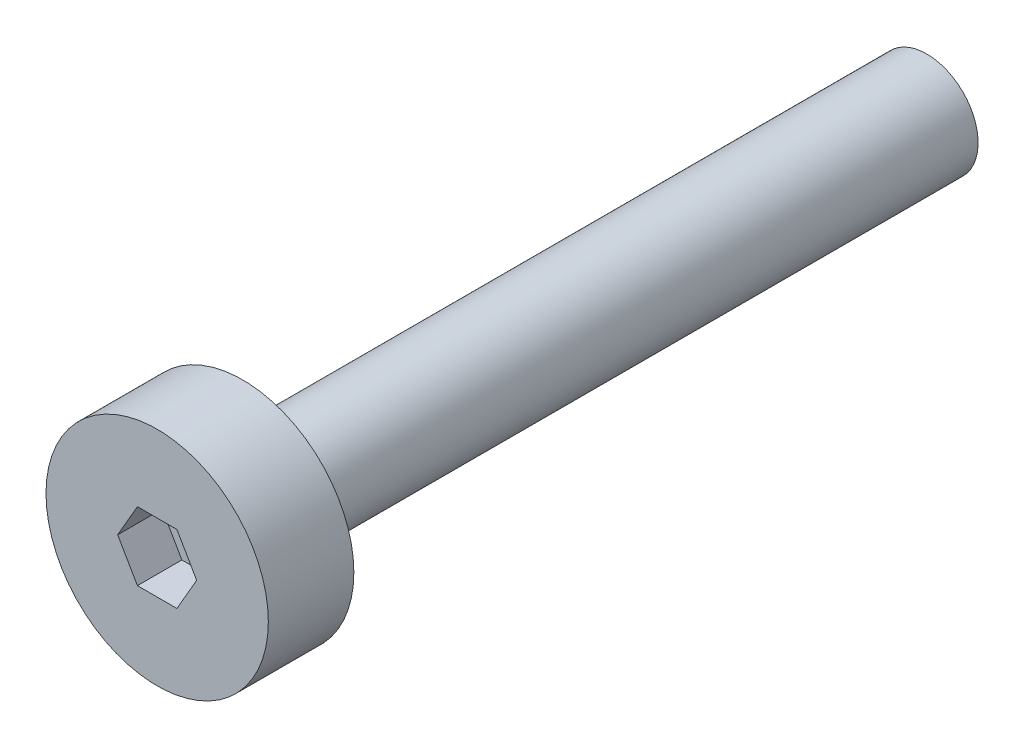
ISO-10303-21;
HEADER;
FILE_DESCRIPTION(('STEP AP214'),'2;1');
FILE_NAME('part.step','',(''),(''),'','','');
FILE_SCHEMA(('AUTOMOTIVE_DESIGN { 1 0 10303 214 1 1 1 1 }'));
ENDSEC;
DATA;
#1=APPLICATION_CONTEXT('core data for automotive mechanical design processes');
#2=APPLICATION_PROTOCOL_DEFINITION('international standard','automotive_design',2000,#1);
#3=PRODUCT_CONTEXT('',#1,'mechanical');
#4=PRODUCT('Part','Part','',(#3));
#5=PRODUCT_RELATED_PRODUCT_CATEGORY('part','',(#4));
#6=PRODUCT_DEFINITION_FORMATION('','',#4);
#7=PRODUCT_DEFINITION_CONTEXT('part definition',#1,'design');
#8=PRODUCT_DEFINITION('design','',#6,#7);
#9=PRODUCT_DEFINITION_SHAPE('','',#8);
#10=(LENGTH_UNIT() NAMED_UNIT(*) SI_UNIT(.MILLI.,.METRE.));
#11=(NAMED_UNIT(*) PLANE_ANGLE_UNIT() SI_UNIT($,.RADIAN.));
#12=(NAMED_UNIT(*) SI_UNIT($,.STERADIAN.) SOLID_ANGLE_UNIT());
#13=UNCERTAINTY_MEASURE_WITH_UNIT(LENGTH_MEASURE(1.E-05),#10,'distance_accuracy_value','');
#14=(GEOMETRIC_REPRESENTATION_CONTEXT(3) GLOBAL_UNCERTAINTY_ASSIGNED_CONTEXT((#13)) GLOBAL_UNIT_ASSIGNED_CONTEXT((#10,
#11,#12)) REPRESENTATION_CONTEXT('',''));
#15=CARTESIAN_POINT('',(0.,0.,0.));
#16=DIRECTION('',(0.,0.,1.));
#17=DIRECTION('',(1.,0.,0.));
#18=AXIS2_PLACEMENT_3D('',#15,#16,#17);
#19=CARTESIAN_POINT('',(0.,0.,1.2));
#20=DIRECTION('',(0.,0.,1.));
#21=DIRECTION('',(1.,0.,0.));
#22=AXIS2_PLACEMENT_3D('',#19,#20,#21);
#23=PLANE('',#22);
#24=DIRECTION('',(-0.50000000000019,0.866025403784329,0.));
#25=VECTOR('',#24,1.);
#26=CARTESIAN_POINT('',(1.154700538379,0.,1.2));
#27=LINE('',#26,#25);
#28=CARTESIAN_POINT('',(1.154700538379,0.,1.2));
#29=VERTEX_POINT('',#28);
#30=CARTESIAN_POINT('',(0.57735026919,1.,1.2));
#31=VERTEX_POINT('',#30);
#32=EDGE_CURVE('E9',#29,#31,#27,.T.);
#33=ORIENTED_EDGE('',*,*,#32,.T.);
#34=DIRECTION('',(-1.,0.,0.));
#35=VECTOR('',#34,1.);
#36=CARTESIAN_POINT('',(0.57735026919,1.,1.2));
#37=LINE('',#36,#35);
#38=CARTESIAN_POINT('',(-0.57735026919,1.,1.2));
#39=VERTEX_POINT('',#38);
#40=EDGE_CURVE('E113',#31,#39,#37,.T.);
#41=ORIENTED_EDGE('',*,*,#40,.T.);
#42=DIRECTION('',(-0.50000000000019,-0.866025403784329,0.));
#43=VECTOR('',#42,1.);
#44=CARTESIAN_POINT('',(-0.57735026919,1.,1.2));
#45=LINE('',#44,#43);
#46=CARTESIAN_POINT('',(-1.154700538379,0.,1.2));
#47=VERTEX_POINT('',#46);
#48=EDGE_CURVE('E109',#39,#47,#45,.T.);
#49=ORIENTED_EDGE('',*,*,#48,.T.);
#50=DIRECTION('',(0.50000000000019,-0.866025403784329,0.));
#51=VECTOR('',#50,1.);
#52=CARTESIAN_POINT('',(-1.154700538379,0.,1.2));
#53=LINE('',#52,#51);
#54=CARTESIAN_POINT('',(-0.57735026919,-1.,1.2));
#55=VERTEX_POINT('',#54);
#56=EDGE_CURVE('E139',#47,#55,#53,.T.);
#57=ORIENTED_EDGE('',*,*,#56,.T.);
#58=DIRECTION('',(1.,0.,0.));
#59=VECTOR('',#58,1.);
#60=CARTESIAN_POINT('',(-0.57735026919,-1.,1.2));
#61=LINE('',#60,#59);
#62=CARTESIAN_POINT('',(0.57735026919,-1.,1.2));
#63=VERTEX_POINT('',#62);
#64=EDGE_CURVE('E64',#55,#63,#61,.T.);
#65=ORIENTED_EDGE('',*,*,#64,.T.);
#66=DIRECTION('',(0.50000000000019,0.866025403784329,0.));
#67=VECTOR('',#66,1.);
#68=CARTESIAN_POINT('',(0.57735026919,-1.,1.2));
#69=LINE('',#68,#67);
#70=EDGE_CURVE('E169',#63,#29,#69,.T.);
#71=ORIENTED_EDGE('',*,*,#70,.T.);
#72=EDGE_LOOP('',(#33,#41,#49,#57,#65,#71));
#73=FACE_BOUND('',#72,.T.);
#74=ADVANCED_FACE('F14',(#73),#23,.T.);
#75=CARTESIAN_POINT('',(0.,0.,-20.));
#76=DIRECTION('',(0.,0.,-1.));
#77=DIRECTION('',(0.,-1.,0.));
#78=AXIS2_PLACEMENT_3D('',#75,#76,#77);
#79=PLANE('',#78);
#80=CARTESIAN_POINT('',(0.,0.,-20.));
#81=DIRECTION('',(0.,0.,-1.));
#82=DIRECTION('',(-1.,0.,0.));
#83=AXIS2_PLACEMENT_3D('',#80,#81,#82);
#84=CIRCLE('',#83,1.5);
#85=CARTESIAN_POINT('',(-1.5,0.,-20.));
#86=VERTEX_POINT('',#85);
#87=EDGE_CURVE('E177',#86,#86,#84,.T.);
#88=ORIENTED_EDGE('',*,*,#87,.T.);
#89=EDGE_LOOP('',(#88));
#90=FACE_BOUND('',#89,.T.);
#91=ADVANCED_FACE('F205',(#90),#79,.T.);
#92=CARTESIAN_POINT('',(1.154700538379,0.,1.2));
#93=DIRECTION('',(-0.866025403784329,-0.50000000000019,0.));
#94=DIRECTION('',(-0.50000000000019,0.866025403784329,0.));
#95=AXIS2_PLACEMENT_3D('',#92,#93,#94);
#96=PLANE('',#95);
#97=ORIENTED_EDGE('',*,*,#32,.F.);
#98=DIRECTION('',(0.,0.,1.));
#99=VECTOR('',#98,1.);
#100=CARTESIAN_POINT('',(1.154700538379,0.,1.2));
#101=LINE('',#100,#99);
#102=CARTESIAN_POINT('',(1.154700538379,0.,2.5));
#103=VERTEX_POINT('',#102);
#104=EDGE_CURVE('E168',#29,#103,#101,.T.);
#105=ORIENTED_EDGE('',*,*,#104,.T.);
#106=DIRECTION('',(-0.50000000000019,0.866025403784329,0.));
#107=VECTOR('',#106,1.);
#108=CARTESIAN_POINT('',(1.010362971082,0.25,2.5));
#109=LINE('',#108,#107);
#110=CARTESIAN_POINT('',(0.57735026919,1.,2.5));
#111=VERTEX_POINT('',#110);
#112=EDGE_CURVE('E121',#103,#111,#109,.T.);
#113=ORIENTED_EDGE('',*,*,#112,.T.);
#114=DIRECTION('',(0.,0.,1.));
#115=VECTOR('',#114,1.);
#116=CARTESIAN_POINT('',(0.57735026919,1.,1.2));
#117=LINE('',#116,#115);
#118=EDGE_CURVE('E25',#31,#111,#117,.T.);
#119=ORIENTED_EDGE('',*,*,#118,.F.);
#120=EDGE_LOOP('',(#97,#105,#113,#119));
#121=FACE_BOUND('',#120,.T.);
#122=ADVANCED_FACE('F211',(#121),#96,.T.);
#123=CARTESIAN_POINT('',(0.57735026919,1.,1.2));
#124=DIRECTION('',(0.,-1.,0.));
#125=DIRECTION('',(-1.,0.,0.));
#126=AXIS2_PLACEMENT_3D('',#123,#124,#125);
#127=PLANE('',#126);
#128=ORIENTED_EDGE('',*,*,#40,.F.);
#129=ORIENTED_EDGE('',*,*,#118,.T.);
#130=DIRECTION('',(-1.,0.,0.));
#131=VECTOR('',#130,1.);
#132=CARTESIAN_POINT('',(0.288675134595,1.,2.5));
#133=LINE('',#132,#131);
#134=CARTESIAN_POINT('',(-0.57735026919,1.,2.5));
#135=VERTEX_POINT('',#134);
#136=EDGE_CURVE('E116',#111,#135,#133,.T.);
#137=ORIENTED_EDGE('',*,*,#136,.T.);
#138=DIRECTION('',(0.,0.,1.));
#139=VECTOR('',#138,1.);
#140=CARTESIAN_POINT('',(-0.57735026919,1.,1.2));
#141=LINE('',#140,#139);
#142=EDGE_CURVE('E102',#39,#135,#141,.T.);
#143=ORIENTED_EDGE('',*,*,#142,.F.);
#144=EDGE_LOOP('',(#128,#129,#137,#143));
#145=FACE_BOUND('',#144,.T.);
#146=ADVANCED_FACE('F16',(#145),#127,.T.);
#147=CARTESIAN_POINT('',(-0.57735026919,1.,1.2));
#148=DIRECTION('',(0.866025403784329,-0.50000000000019,0.));
#149=DIRECTION('',(0.,0.,-1.));
#150=AXIS2_PLACEMENT_3D('',#147,#148,#149);
#151=PLANE('',#150);
#152=ORIENTED_EDGE('',*,*,#48,.F.);
#153=ORIENTED_EDGE('',*,*,#142,.T.);
#154=DIRECTION('',(-0.50000000000019,-0.866025403784329,0.));
#155=VECTOR('',#154,1.);
#156=CARTESIAN_POINT('',(-0.721687836487,0.75,2.5));
#157=LINE('',#156,#155);
#158=CARTESIAN_POINT('',(-1.154700538379,0.,2.5));
#159=VERTEX_POINT('',#158);
#160=EDGE_CURVE('E106',#135,#159,#157,.T.);
#161=ORIENTED_EDGE('',*,*,#160,.T.);
#162=DIRECTION('',(0.,0.,1.));
#163=VECTOR('',#162,1.);
#164=CARTESIAN_POINT('',(-1.154700538379,0.,1.2));
#165=LINE('',#164,#163);
#166=EDGE_CURVE('E94',#47,#159,#165,.T.);
#167=ORIENTED_EDGE('',*,*,#166,.F.);
#168=EDGE_LOOP('',(#152,#153,#161,#167));
#169=FACE_BOUND('',#168,.T.);
#170=ADVANCED_FACE('F104',(#169),#151,.T.);
#171=CARTESIAN_POINT('',(-1.154700538379,0.,1.2));
#172=DIRECTION('',(0.866025403784329,0.50000000000019,0.));
#173=DIRECTION('',(0.,0.,-1.));
#174=AXIS2_PLACEMENT_3D('',#171,#172,#173);
#175=PLANE('',#174);
#176=ORIENTED_EDGE('',*,*,#56,.F.);
#177=ORIENTED_EDGE('',*,*,#166,.T.);
#178=DIRECTION('',(0.50000000000019,-0.866025403784329,0.));
#179=VECTOR('',#178,1.);
#180=CARTESIAN_POINT('',(-1.010362971082,-0.25,2.5));
#181=LINE('',#180,#179);
#182=CARTESIAN_POINT('',(-0.57735026919,-1.,2.5));
#183=VERTEX_POINT('',#182);
#184=EDGE_CURVE('E126',#159,#183,#181,.T.);
#185=ORIENTED_EDGE('',*,*,#184,.T.);
#186=DIRECTION('',(0.,0.,1.));
#187=VECTOR('',#186,1.);
#188=CARTESIAN_POINT('',(-0.57735026919,-1.,1.2));
#189=LINE('',#188,#187);
#190=EDGE_CURVE('E140',#55,#183,#189,.T.);
#191=ORIENTED_EDGE('',*,*,#190,.F.);
#192=EDGE_LOOP('',(#176,#177,#185,#191));
#193=FACE_BOUND('',#192,.T.);
#194=ADVANCED_FACE('F195',(#193),#175,.T.);
#195=CARTESIAN_POINT('',(-0.57735026919,-1.,1.2));
#196=DIRECTION('',(0.,1.,0.));
#197=DIRECTION('',(1.,0.,0.));
#198=AXIS2_PLACEMENT_3D('',#195,#196,#197);
#199=PLANE('',#198);
#200=ORIENTED_EDGE('',*,*,#64,.F.);
#201=ORIENTED_EDGE('',*,*,#190,.T.);
#202=DIRECTION('',(1.,0.,0.));
#203=VECTOR('',#202,1.);
#204=CARTESIAN_POINT('',(-0.288675134595,-1.,2.5));
#205=LINE('',#204,#203);
#206=CARTESIAN_POINT('',(0.57735026919,-1.,2.5));
#207=VERTEX_POINT('',#206);
#208=EDGE_CURVE('E133',#183,#207,#205,.T.);
#209=ORIENTED_EDGE('',*,*,#208,.T.);
#210=DIRECTION('',(0.,0.,1.));
#211=VECTOR('',#210,1.);
#212=CARTESIAN_POINT('',(0.57735026919,-1.,1.2));
#213=LINE('',#212,#211);
#214=EDGE_CURVE('E165',#63,#207,#213,.T.);
#215=ORIENTED_EDGE('',*,*,#214,.F.);
#216=EDGE_LOOP('',(#200,#201,#209,#215));
#217=FACE_BOUND('',#216,.T.);
#218=ADVANCED_FACE('F194',(#217),#199,.T.);
#219=CARTESIAN_POINT('',(0.57735026919,-1.,1.2));
#220=DIRECTION('',(-0.866025403784329,0.50000000000019,0.));
#221=DIRECTION('',(0.,0.,1.));
#222=AXIS2_PLACEMENT_3D('',#219,#220,#221);
#223=PLANE('',#222);
#224=ORIENTED_EDGE('',*,*,#70,.F.);
#225=ORIENTED_EDGE('',*,*,#214,.T.);
#226=DIRECTION('',(0.50000000000019,0.866025403784329,0.));
#227=VECTOR('',#226,1.);
#228=CARTESIAN_POINT('',(0.721687836487,-0.75,2.5));
#229=LINE('',#228,#227);
#230=EDGE_CURVE('E137',#207,#103,#229,.T.);
#231=ORIENTED_EDGE('',*,*,#230,.T.);
#232=ORIENTED_EDGE('',*,*,#104,.F.);
#233=EDGE_LOOP('',(#224,#225,#231,#232));
#234=FACE_BOUND('',#233,.T.);
#235=ADVANCED_FACE('F203',(#234),#223,.T.);
#236=CARTESIAN_POINT('',(0.,0.,0.));
#237=DIRECTION('',(0.,0.,-1.));
#238=DIRECTION('',(-1.,0.,0.));
#239=AXIS2_PLACEMENT_3D('',#236,#237,#238);
#240=CYLINDRICAL_SURFACE('',#239,1.5);
#241=ORIENTED_EDGE('',*,*,#87,.F.);
#242=DIRECTION('',(0.,0.,-1.));
#243=VECTOR('',#242,1.);
#244=CARTESIAN_POINT('',(-1.5,0.,0.));
#245=LINE('',#244,#243);
#246=CARTESIAN_POINT('',(-1.5,0.,0.));
#247=VERTEX_POINT('',#246);
#248=EDGE_CURVE('E174',#247,#86,#245,.T.);
#249=ORIENTED_EDGE('',*,*,#248,.F.);
#250=CARTESIAN_POINT('',(0.,0.,0.));
#251=DIRECTION('',(0.,0.,-1.));
#252=DIRECTION('',(-1.,0.,0.));
#253=AXIS2_PLACEMENT_3D('',#250,#251,#252);
#254=CIRCLE('',#253,1.5);
#255=EDGE_CURVE('E18',#247,#247,#254,.T.);
#256=ORIENTED_EDGE('',*,*,#255,.T.);
#257=ORIENTED_EDGE('',*,*,#248,.T.);
#258=EDGE_LOOP('',(#241,#249,#256,#257));
#259=FACE_BOUND('',#258,.T.);
#260=ADVANCED_FACE('F225',(#259),#240,.T.);
#261=CARTESIAN_POINT('',(0.,0.,2.5));
#262=DIRECTION('',(0.,0.,-1.));
#263=DIRECTION('',(0.,-1.,0.));
#264=AXIS2_PLACEMENT_3D('',#261,#262,#263);
#265=PLANE('',#264);
#266=ORIENTED_EDGE('',*,*,#208,.F.);
#267=ORIENTED_EDGE('',*,*,#184,.F.);
#268=ORIENTED_EDGE('',*,*,#160,.F.);
#269=ORIENTED_EDGE('',*,*,#136,.F.);
#270=ORIENTED_EDGE('',*,*,#112,.F.);
#271=ORIENTED_EDGE('',*,*,#230,.F.);
#272=EDGE_LOOP('',(#266,#267,#268,#269,#270,#271));
#273=FACE_BOUND('',#272,.T.);
#274=CARTESIAN_POINT('',(0.,0.,2.5));
#275=DIRECTION('',(0.,0.,-1.));
#276=DIRECTION('',(-1.,0.,0.));
#277=AXIS2_PLACEMENT_3D('',#274,#275,#276);
#278=CIRCLE('',#277,3.25);
#279=CARTESIAN_POINT('',(-3.25,0.,2.5));
#280=VERTEX_POINT('',#279);
#281=EDGE_CURVE('E144',#280,#280,#278,.T.);
#282=ORIENTED_EDGE('',*,*,#281,.F.);
#283=EDGE_LOOP('',(#282));
#284=FACE_BOUND('',#283,.T.);
#285=ADVANCED_FACE('F124',(#273,#284),#265,.F.);
#286=CARTESIAN_POINT('',(0.,0.,0.));
#287=DIRECTION('',(0.,0.,-1.));
#288=DIRECTION('',(0.,-1.,0.));
#289=AXIS2_PLACEMENT_3D('',#286,#287,#288);
#290=PLANE('',#289);
#291=ORIENTED_EDGE('',*,*,#255,.F.);
#292=EDGE_LOOP('',(#291));
#293=FACE_BOUND('',#292,.T.);
#294=CARTESIAN_POINT('',(0.,0.,0.));
#295=DIRECTION('',(0.,0.,-1.));
#296=DIRECTION('',(-1.,0.,0.));
#297=AXIS2_PLACEMENT_3D('',#294,#295,#296);
#298=CIRCLE('',#297,3.25);
#299=CARTESIAN_POINT('',(-3.25,0.,0.));
#300=VERTEX_POINT('',#299);
#301=EDGE_CURVE('E155',#300,#300,#298,.T.);
#302=ORIENTED_EDGE('',*,*,#301,.T.);
#303=EDGE_LOOP('',(#302));
#304=FACE_BOUND('',#303,.T.);
#305=ADVANCED_FACE('F222',(#293,#304),#290,.T.);
#306=CARTESIAN_POINT('',(0.,0.,2.5));
#307=DIRECTION('',(0.,0.,-1.));
#308=DIRECTION('',(-1.,0.,0.));
#309=AXIS2_PLACEMENT_3D('',#306,#307,#308);
#310=CYLINDRICAL_SURFACE('',#309,3.25);
#311=ORIENTED_EDGE('',*,*,#301,.F.);
#312=DIRECTION('',(0.,0.,-1.));
#313=VECTOR('',#312,1.);
#314=CARTESIAN_POINT('',(-3.25,0.,2.5));
#315=LINE('',#314,#313);
#316=EDGE_CURVE('E146',#280,#300,#315,.T.);
#317=ORIENTED_EDGE('',*,*,#316,.F.);
#318=ORIENTED_EDGE('',*,*,#281,.T.);
#319=ORIENTED_EDGE('',*,*,#316,.T.);
#320=EDGE_LOOP('',(#311,#317,#318,#319));
#321=FACE_BOUND('',#320,.T.);
#322=ADVANCED_FACE('F219',(#321),#310,.T.);
#323=CLOSED_SHELL('',(#74,#91,#122,#146,#170,#194,#218,#235,#260,#285,#305,#322));
#324=MANIFOLD_SOLID_BREP('B1',#323);
#325=ADVANCED_BREP_SHAPE_REPRESENTATION('',(#18,#324),#14);
#326=SHAPE_DEFINITION_REPRESENTATION(#9,#325);
ENDSEC;
END-ISO-10303-21;
